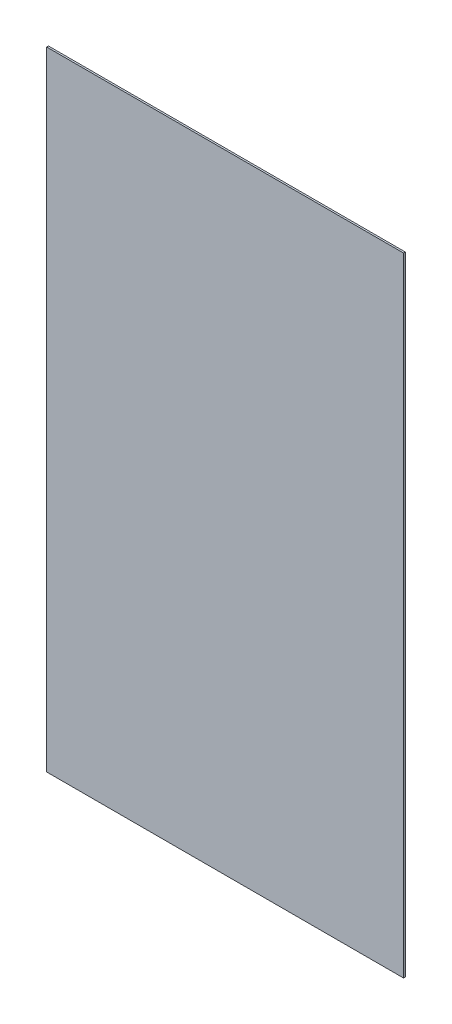
ISO-10303-21;
HEADER;
FILE_DESCRIPTION(('STEP AP214'),'2;1');
FILE_NAME('part.step','',(''),(''),'','','');
FILE_SCHEMA(('AUTOMOTIVE_DESIGN { 1 0 10303 214 1 1 1 1 }'));
ENDSEC;
DATA;
#1=APPLICATION_CONTEXT('core data for automotive mechanical design processes');
#2=APPLICATION_PROTOCOL_DEFINITION('international standard','automotive_design',2000,#1);
#3=PRODUCT_CONTEXT('',#1,'mechanical');
#4=PRODUCT('Part','Part','',(#3));
#5=PRODUCT_RELATED_PRODUCT_CATEGORY('part','',(#4));
#6=PRODUCT_DEFINITION_FORMATION('','',#4);
#7=PRODUCT_DEFINITION_CONTEXT('part definition',#1,'design');
#8=PRODUCT_DEFINITION('design','',#6,#7);
#9=PRODUCT_DEFINITION_SHAPE('','',#8);
#10=(LENGTH_UNIT() NAMED_UNIT(*) SI_UNIT(.MILLI.,.METRE.));
#11=(NAMED_UNIT(*) PLANE_ANGLE_UNIT() SI_UNIT($,.RADIAN.));
#12=(NAMED_UNIT(*) SI_UNIT($,.STERADIAN.) SOLID_ANGLE_UNIT());
#13=UNCERTAINTY_MEASURE_WITH_UNIT(LENGTH_MEASURE(1.E-05),#10,'distance_accuracy_value','');
#14=(GEOMETRIC_REPRESENTATION_CONTEXT(3) GLOBAL_UNCERTAINTY_ASSIGNED_CONTEXT((#13)) GLOBAL_UNIT_ASSIGNED_CONTEXT((#10,
#11,#12)) REPRESENTATION_CONTEXT('',''));
#15=CARTESIAN_POINT('',(0.,0.,0.));
#16=DIRECTION('',(0.,0.,1.));
#17=DIRECTION('',(1.,0.,0.));
#18=AXIS2_PLACEMENT_3D('',#15,#16,#17);
#19=CARTESIAN_POINT('',(-25.,-46.4821428571428,0.));
#20=DIRECTION('',(0.,-1.,0.));
#21=DIRECTION('',(0.,0.,-1.));
#22=AXIS2_PLACEMENT_3D('',#19,#20,#21);
#23=PLANE('',#22);
#24=DIRECTION('',(1.,0.,0.));
#25=VECTOR('',#24,1.);
#26=CARTESIAN_POINT('',(-25.,-46.4821428571428,0.25));
#27=LINE('',#26,#25);
#28=CARTESIAN_POINT('',(-25.,-46.4821428571428,0.25));
#29=VERTEX_POINT('',#28);
#30=CARTESIAN_POINT('',(25.,-46.4821428571428,0.25));
#31=VERTEX_POINT('',#30);
#32=EDGE_CURVE('E97',#29,#31,#27,.T.);
#33=ORIENTED_EDGE('',*,*,#32,.F.);
#34=DIRECTION('',(0.,0.,1.));
#35=VECTOR('',#34,1.);
#36=CARTESIAN_POINT('',(-25.,-46.4821428571428,0.));
#37=LINE('',#36,#35);
#38=CARTESIAN_POINT('',(-25.,-46.4821428571428,0.));
#39=VERTEX_POINT('',#38);
#40=EDGE_CURVE('E11',#39,#29,#37,.T.);
#41=ORIENTED_EDGE('',*,*,#40,.F.);
#42=DIRECTION('',(1.,0.,0.));
#43=VECTOR('',#42,1.);
#44=CARTESIAN_POINT('',(-25.,-46.4821428571428,0.));
#45=LINE('',#44,#43);
#46=CARTESIAN_POINT('',(25.,-46.4821428571428,0.));
#47=VERTEX_POINT('',#46);
#48=EDGE_CURVE('E91',#39,#47,#45,.T.);
#49=ORIENTED_EDGE('',*,*,#48,.T.);
#50=DIRECTION('',(0.,0.,1.));
#51=VECTOR('',#50,1.);
#52=CARTESIAN_POINT('',(25.,-46.4821428571428,0.));
#53=LINE('',#52,#51);
#54=EDGE_CURVE('E36',#47,#31,#53,.T.);
#55=ORIENTED_EDGE('',*,*,#54,.T.);
#56=EDGE_LOOP('',(#33,#41,#49,#55));
#57=FACE_BOUND('',#56,.T.);
#58=ADVANCED_FACE('F33',(#57),#23,.T.);
#59=CARTESIAN_POINT('',(-25.,41.5178571428571,0.));
#60=DIRECTION('',(-1.,0.,0.));
#61=DIRECTION('',(0.,-1.,0.));
#62=AXIS2_PLACEMENT_3D('',#59,#60,#61);
#63=PLANE('',#62);
#64=DIRECTION('',(0.,-1.,0.));
#65=VECTOR('',#64,1.);
#66=CARTESIAN_POINT('',(-25.,41.5178571428571,0.25));
#67=LINE('',#66,#65);
#68=CARTESIAN_POINT('',(-25.,41.5178571428571,0.25));
#69=VERTEX_POINT('',#68);
#70=EDGE_CURVE('E93',#69,#29,#67,.T.);
#71=ORIENTED_EDGE('',*,*,#70,.F.);
#72=DIRECTION('',(0.,0.,1.));
#73=VECTOR('',#72,1.);
#74=CARTESIAN_POINT('',(-25.,41.5178571428571,0.));
#75=LINE('',#74,#73);
#76=CARTESIAN_POINT('',(-25.,41.5178571428571,0.));
#77=VERTEX_POINT('',#76);
#78=EDGE_CURVE('E42',#77,#69,#75,.T.);
#79=ORIENTED_EDGE('',*,*,#78,.F.);
#80=DIRECTION('',(0.,-1.,0.));
#81=VECTOR('',#80,1.);
#82=CARTESIAN_POINT('',(-25.,41.5178571428571,0.));
#83=LINE('',#82,#81);
#84=EDGE_CURVE('E88',#77,#39,#83,.T.);
#85=ORIENTED_EDGE('',*,*,#84,.T.);
#86=ORIENTED_EDGE('',*,*,#40,.T.);
#87=EDGE_LOOP('',(#71,#79,#85,#86));
#88=FACE_BOUND('',#87,.T.);
#89=ADVANCED_FACE('F107',(#88),#63,.T.);
#90=CARTESIAN_POINT('',(25.,41.5178571428571,0.));
#91=DIRECTION('',(0.,1.,0.));
#92=DIRECTION('',(0.,0.,1.));
#93=AXIS2_PLACEMENT_3D('',#90,#91,#92);
#94=PLANE('',#93);
#95=DIRECTION('',(-1.,0.,0.));
#96=VECTOR('',#95,1.);
#97=CARTESIAN_POINT('',(25.,41.5178571428571,0.25));
#98=LINE('',#97,#96);
#99=CARTESIAN_POINT('',(25.,41.5178571428571,0.25));
#100=VERTEX_POINT('',#99);
#101=EDGE_CURVE('E83',#100,#69,#98,.T.);
#102=ORIENTED_EDGE('',*,*,#101,.F.);
#103=DIRECTION('',(0.,0.,1.));
#104=VECTOR('',#103,1.);
#105=CARTESIAN_POINT('',(25.,41.5178571428571,0.));
#106=LINE('',#105,#104);
#107=CARTESIAN_POINT('',(25.,41.5178571428571,0.));
#108=VERTEX_POINT('',#107);
#109=EDGE_CURVE('E78',#108,#100,#106,.T.);
#110=ORIENTED_EDGE('',*,*,#109,.F.);
#111=DIRECTION('',(-1.,0.,0.));
#112=VECTOR('',#111,1.);
#113=CARTESIAN_POINT('',(25.,41.5178571428571,0.));
#114=LINE('',#113,#112);
#115=EDGE_CURVE('E81',#108,#77,#114,.T.);
#116=ORIENTED_EDGE('',*,*,#115,.T.);
#117=ORIENTED_EDGE('',*,*,#78,.T.);
#118=EDGE_LOOP('',(#102,#110,#116,#117));
#119=FACE_BOUND('',#118,.T.);
#120=ADVANCED_FACE('F80',(#119),#94,.T.);
#121=CARTESIAN_POINT('',(25.,-46.4821428571428,0.));
#122=DIRECTION('',(1.,0.,0.));
#123=DIRECTION('',(0.,1.,0.));
#124=AXIS2_PLACEMENT_3D('',#121,#122,#123);
#125=PLANE('',#124);
#126=DIRECTION('',(0.,1.,0.));
#127=VECTOR('',#126,1.);
#128=CARTESIAN_POINT('',(25.,-46.4821428571428,0.25));
#129=LINE('',#128,#127);
#130=EDGE_CURVE('E100',#31,#100,#129,.T.);
#131=ORIENTED_EDGE('',*,*,#130,.F.);
#132=ORIENTED_EDGE('',*,*,#54,.F.);
#133=DIRECTION('',(0.,1.,0.));
#134=VECTOR('',#133,1.);
#135=CARTESIAN_POINT('',(25.,-46.4821428571428,0.));
#136=LINE('',#135,#134);
#137=EDGE_CURVE('E87',#47,#108,#136,.T.);
#138=ORIENTED_EDGE('',*,*,#137,.T.);
#139=ORIENTED_EDGE('',*,*,#109,.T.);
#140=EDGE_LOOP('',(#131,#132,#138,#139));
#141=FACE_BOUND('',#140,.T.);
#142=ADVANCED_FACE('F90',(#141),#125,.T.);
#143=CARTESIAN_POINT('',(0.,0.,0.));
#144=DIRECTION('',(0.,0.,1.));
#145=DIRECTION('',(1.,0.,0.));
#146=AXIS2_PLACEMENT_3D('',#143,#144,#145);
#147=PLANE('',#146);
#148=ORIENTED_EDGE('',*,*,#48,.F.);
#149=ORIENTED_EDGE('',*,*,#84,.F.);
#150=ORIENTED_EDGE('',*,*,#115,.F.);
#151=ORIENTED_EDGE('',*,*,#137,.F.);
#152=EDGE_LOOP('',(#148,#149,#150,#151));
#153=FACE_BOUND('',#152,.T.);
#154=ADVANCED_FACE('F86',(#153),#147,.F.);
#155=CARTESIAN_POINT('',(0.,0.,0.25));
#156=DIRECTION('',(0.,0.,1.));
#157=DIRECTION('',(1.,0.,0.));
#158=AXIS2_PLACEMENT_3D('',#155,#156,#157);
#159=PLANE('',#158);
#160=ORIENTED_EDGE('',*,*,#32,.T.);
#161=ORIENTED_EDGE('',*,*,#130,.T.);
#162=ORIENTED_EDGE('',*,*,#101,.T.);
#163=ORIENTED_EDGE('',*,*,#70,.T.);
#164=EDGE_LOOP('',(#160,#161,#162,#163));
#165=FACE_BOUND('',#164,.T.);
#166=ADVANCED_FACE('F106',(#165),#159,.T.);
#167=CLOSED_SHELL('',(#58,#89,#120,#142,#154,#166));
#168=MANIFOLD_SOLID_BREP('B2',#167);
#169=ADVANCED_BREP_SHAPE_REPRESENTATION('',(#18,#168),#14);
#170=SHAPE_DEFINITION_REPRESENTATION(#9,#169);
ENDSEC;
END-ISO-10303-21;
